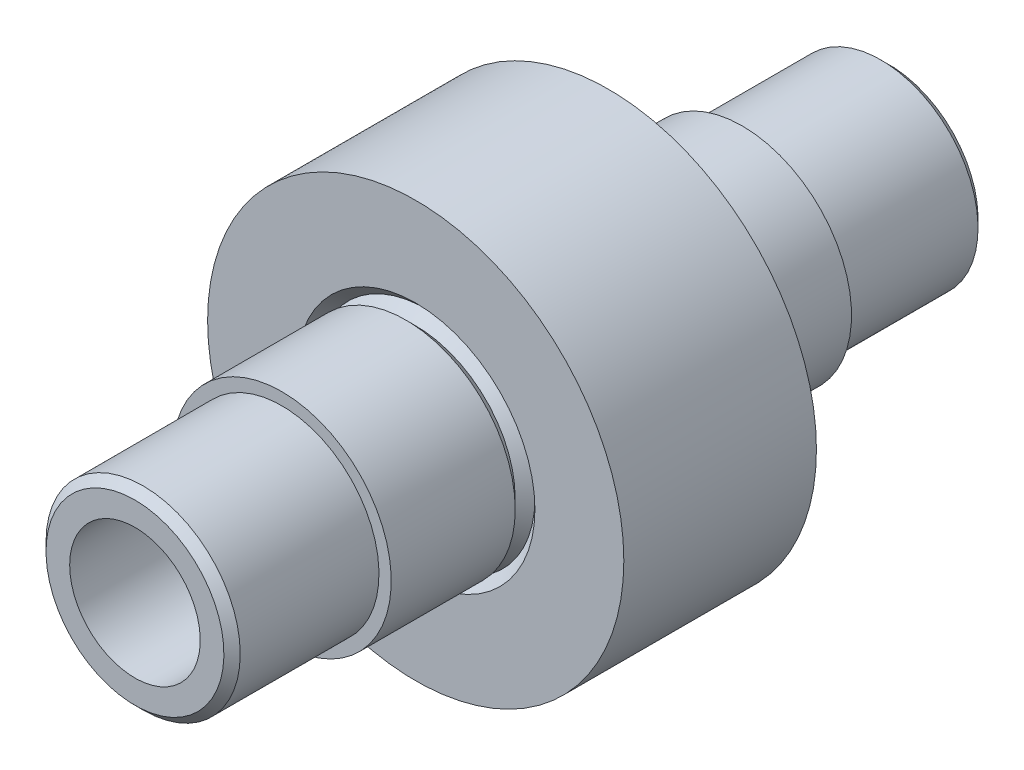
ISO-10303-21;
HEADER;
FILE_DESCRIPTION(('STEP AP214'),'2;1');
FILE_NAME('part.step','',(''),(''),'','','');
FILE_SCHEMA(('AUTOMOTIVE_DESIGN { 1 0 10303 214 1 1 1 1 }'));
ENDSEC;
DATA;
#1=APPLICATION_CONTEXT('core data for automotive mechanical design processes');
#2=APPLICATION_PROTOCOL_DEFINITION('international standard','automotive_design',2000,#1);
#3=PRODUCT_CONTEXT('',#1,'mechanical');
#4=PRODUCT('Part','Part','',(#3));
#5=PRODUCT_RELATED_PRODUCT_CATEGORY('part','',(#4));
#6=PRODUCT_DEFINITION_FORMATION('','',#4);
#7=PRODUCT_DEFINITION_CONTEXT('part definition',#1,'design');
#8=PRODUCT_DEFINITION('design','',#6,#7);
#9=PRODUCT_DEFINITION_SHAPE('','',#8);
#10=(LENGTH_UNIT() NAMED_UNIT(*) SI_UNIT(.MILLI.,.METRE.));
#11=(NAMED_UNIT(*) PLANE_ANGLE_UNIT() SI_UNIT($,.RADIAN.));
#12=(NAMED_UNIT(*) SI_UNIT($,.STERADIAN.) SOLID_ANGLE_UNIT());
#13=UNCERTAINTY_MEASURE_WITH_UNIT(LENGTH_MEASURE(1.E-05),#10,'distance_accuracy_value','');
#14=(GEOMETRIC_REPRESENTATION_CONTEXT(3) GLOBAL_UNCERTAINTY_ASSIGNED_CONTEXT((#13)) GLOBAL_UNIT_ASSIGNED_CONTEXT((#10,
#11,#12)) REPRESENTATION_CONTEXT('',''));
#15=CARTESIAN_POINT('',(0.,0.,0.));
#16=DIRECTION('',(0.,0.,1.));
#17=DIRECTION('',(1.,0.,0.));
#18=AXIS2_PLACEMENT_3D('',#15,#16,#17);
#19=CARTESIAN_POINT('',(0.,0.,23.1));
#20=DIRECTION('',(0.,0.,1.));
#21=DIRECTION('',(0.,-1.,0.));
#22=AXIS2_PLACEMENT_3D('',#19,#20,#21);
#23=CYLINDRICAL_SURFACE('',#22,6.7);
#24=CARTESIAN_POINT('',(0.,0.,-14.1));
#25=DIRECTION('',(0.,0.,1.));
#26=DIRECTION('',(0.,-1.,0.));
#27=AXIS2_PLACEMENT_3D('',#24,#25,#26);
#28=CIRCLE('',#27,6.7);
#29=CARTESIAN_POINT('',(0.,-6.69999999999999,-14.1));
#30=VERTEX_POINT('',#29);
#31=EDGE_CURVE('E66',#30,#30,#28,.T.);
#32=ORIENTED_EDGE('',*,*,#31,.T.);
#33=EDGE_LOOP('',(#32));
#34=FACE_BOUND('',#33,.T.);
#35=CARTESIAN_POINT('',(0.,0.,-6.50214500503883));
#36=DIRECTION('',(0.,0.,1.));
#37=DIRECTION('',(1.,0.,0.));
#38=AXIS2_PLACEMENT_3D('',#35,#36,#37);
#39=CIRCLE('',#38,6.7);
#40=CARTESIAN_POINT('',(6.7,0.,-6.50214500503883));
#41=VERTEX_POINT('',#40);
#42=EDGE_CURVE('E93',#41,#41,#39,.T.);
#43=ORIENTED_EDGE('',*,*,#42,.F.);
#44=EDGE_LOOP('',(#43));
#45=FACE_BOUND('',#44,.T.);
#46=ADVANCED_FACE('F37',(#34,#45),#23,.T.);
#47=CARTESIAN_POINT('',(0.,0.,23.1));
#48=DIRECTION('',(0.,0.,1.));
#49=DIRECTION('',(0.,-1.,0.));
#50=AXIS2_PLACEMENT_3D('',#47,#48,#49);
#51=CYLINDRICAL_SURFACE('',#50,6.7);
#52=CARTESIAN_POINT('',(0.,0.,14.1));
#53=DIRECTION('',(0.,0.,1.));
#54=DIRECTION('',(0.,-1.,0.));
#55=AXIS2_PLACEMENT_3D('',#52,#53,#54);
#56=CIRCLE('',#55,6.7);
#57=CARTESIAN_POINT('',(0.,-6.7,14.1));
#58=VERTEX_POINT('',#57);
#59=EDGE_CURVE('E69',#58,#58,#56,.T.);
#60=ORIENTED_EDGE('',*,*,#59,.F.);
#61=EDGE_LOOP('',(#60));
#62=FACE_BOUND('',#61,.T.);
#63=CARTESIAN_POINT('',(0.,0.,6.50214500503883));
#64=DIRECTION('',(0.,0.,1.));
#65=DIRECTION('',(1.,0.,0.));
#66=AXIS2_PLACEMENT_3D('',#63,#64,#65);
#67=CIRCLE('',#66,6.7);
#68=CARTESIAN_POINT('',(6.7,0.,6.50214500503883));
#69=VERTEX_POINT('',#68);
#70=EDGE_CURVE('E80',#69,#69,#67,.T.);
#71=ORIENTED_EDGE('',*,*,#70,.T.);
#72=EDGE_LOOP('',(#71));
#73=FACE_BOUND('',#72,.T.);
#74=ADVANCED_FACE('F132',(#62,#73),#51,.T.);
#75=CARTESIAN_POINT('',(0.,0.,-23.1));
#76=DIRECTION('',(0.,0.,1.));
#77=DIRECTION('',(0.,-1.,0.));
#78=AXIS2_PLACEMENT_3D('',#75,#76,#77);
#79=PLANE('',#78);
#80=CARTESIAN_POINT('',(0.,0.,-23.1));
#81=DIRECTION('',(0.,0.,1.));
#82=DIRECTION('',(0.,-1.,0.));
#83=AXIS2_PLACEMENT_3D('',#80,#81,#82);
#84=CIRCLE('',#83,5.45);
#85=CARTESIAN_POINT('',(0.,-5.45,-23.1));
#86=VERTEX_POINT('',#85);
#87=EDGE_CURVE('E49',#86,#86,#84,.F.);
#88=ORIENTED_EDGE('',*,*,#87,.T.);
#89=EDGE_LOOP('',(#88));
#90=FACE_BOUND('',#89,.T.);
#91=CARTESIAN_POINT('',(0.,0.,-23.1));
#92=DIRECTION('',(0.,0.,-1.));
#93=DIRECTION('',(-1.,0.,0.));
#94=AXIS2_PLACEMENT_3D('',#91,#92,#93);
#95=CIRCLE('',#94,4.);
#96=CARTESIAN_POINT('',(-4.,0.,-23.1));
#97=VERTEX_POINT('',#96);
#98=EDGE_CURVE('E77',#97,#97,#95,.T.);
#99=ORIENTED_EDGE('',*,*,#98,.F.);
#100=EDGE_LOOP('',(#99));
#101=FACE_BOUND('',#100,.T.);
#102=ADVANCED_FACE('F138',(#90,#101),#79,.F.);
#103=CARTESIAN_POINT('',(0.,0.,23.1));
#104=DIRECTION('',(0.,0.,1.));
#105=DIRECTION('',(0.,-1.,0.));
#106=AXIS2_PLACEMENT_3D('',#103,#104,#105);
#107=CYLINDRICAL_SURFACE('',#106,5.95);
#108=CARTESIAN_POINT('',(0.,0.,-22.6));
#109=DIRECTION('',(0.,0.,1.));
#110=DIRECTION('',(0.,-1.,0.));
#111=AXIS2_PLACEMENT_3D('',#108,#109,#110);
#112=CIRCLE('',#111,5.95);
#113=CARTESIAN_POINT('',(0.,-5.94999999999999,-22.6));
#114=VERTEX_POINT('',#113);
#115=EDGE_CURVE('E53',#114,#114,#112,.T.);
#116=ORIENTED_EDGE('',*,*,#115,.T.);
#117=EDGE_LOOP('',(#116));
#118=FACE_BOUND('',#117,.T.);
#119=CARTESIAN_POINT('',(0.,0.,-14.1));
#120=DIRECTION('',(0.,0.,1.));
#121=DIRECTION('',(0.,-1.,0.));
#122=AXIS2_PLACEMENT_3D('',#119,#120,#121);
#123=CIRCLE('',#122,5.95);
#124=CARTESIAN_POINT('',(0.,-5.94999999999999,-14.1));
#125=VERTEX_POINT('',#124);
#126=EDGE_CURVE('E58',#125,#125,#123,.T.);
#127=ORIENTED_EDGE('',*,*,#126,.F.);
#128=EDGE_LOOP('',(#127));
#129=FACE_BOUND('',#128,.T.);
#130=ADVANCED_FACE('F147',(#118,#129),#107,.T.);
#131=CARTESIAN_POINT('',(0.,6.7,-14.1));
#132=DIRECTION('',(0.,0.,1.));
#133=DIRECTION('',(0.,-1.,0.));
#134=AXIS2_PLACEMENT_3D('',#131,#132,#133);
#135=PLANE('',#134);
#136=ORIENTED_EDGE('',*,*,#31,.F.);
#137=EDGE_LOOP('',(#136));
#138=FACE_BOUND('',#137,.T.);
#139=ORIENTED_EDGE('',*,*,#126,.T.);
#140=EDGE_LOOP('',(#139));
#141=FACE_BOUND('',#140,.T.);
#142=ADVANCED_FACE('F143',(#138,#141),#135,.F.);
#143=CARTESIAN_POINT('',(0.,6.7,14.1));
#144=DIRECTION('',(0.,0.,-1.));
#145=DIRECTION('',(0.,1.,0.));
#146=AXIS2_PLACEMENT_3D('',#143,#144,#145);
#147=PLANE('',#146);
#148=CARTESIAN_POINT('',(0.,0.,14.1));
#149=DIRECTION('',(0.,0.,1.));
#150=DIRECTION('',(0.,-1.,0.));
#151=AXIS2_PLACEMENT_3D('',#148,#149,#150);
#152=CIRCLE('',#151,5.95);
#153=CARTESIAN_POINT('',(0.,-5.95,14.1));
#154=VERTEX_POINT('',#153);
#155=EDGE_CURVE('E62',#154,#154,#152,.T.);
#156=ORIENTED_EDGE('',*,*,#155,.F.);
#157=EDGE_LOOP('',(#156));
#158=FACE_BOUND('',#157,.T.);
#159=ORIENTED_EDGE('',*,*,#59,.T.);
#160=EDGE_LOOP('',(#159));
#161=FACE_BOUND('',#160,.T.);
#162=ADVANCED_FACE('F146',(#158,#161),#147,.F.);
#163=CARTESIAN_POINT('',(0.,0.,23.1));
#164=DIRECTION('',(0.,0.,1.));
#165=DIRECTION('',(0.,-1.,0.));
#166=AXIS2_PLACEMENT_3D('',#163,#164,#165);
#167=CYLINDRICAL_SURFACE('',#166,5.95);
#168=CARTESIAN_POINT('',(0.,0.,22.6));
#169=DIRECTION('',(0.,0.,-1.));
#170=DIRECTION('',(0.,1.,0.));
#171=AXIS2_PLACEMENT_3D('',#168,#169,#170);
#172=CIRCLE('',#171,5.95);
#173=CARTESIAN_POINT('',(0.,5.95,22.6));
#174=VERTEX_POINT('',#173);
#175=EDGE_CURVE('E10',#174,#174,#172,.T.);
#176=ORIENTED_EDGE('',*,*,#175,.T.);
#177=EDGE_LOOP('',(#176));
#178=FACE_BOUND('',#177,.T.);
#179=ORIENTED_EDGE('',*,*,#155,.T.);
#180=EDGE_LOOP('',(#179));
#181=FACE_BOUND('',#180,.T.);
#182=ADVANCED_FACE('F184',(#178,#181),#167,.T.);
#183=CARTESIAN_POINT('',(0.,0.,23.1));
#184=DIRECTION('',(0.,0.,-1.));
#185=DIRECTION('',(0.,1.,0.));
#186=AXIS2_PLACEMENT_3D('',#183,#184,#185);
#187=PLANE('',#186);
#188=CARTESIAN_POINT('',(0.,0.,23.1));
#189=DIRECTION('',(0.,0.,-1.));
#190=DIRECTION('',(0.,1.,0.));
#191=AXIS2_PLACEMENT_3D('',#188,#189,#190);
#192=CIRCLE('',#191,5.45000000000002);
#193=CARTESIAN_POINT('',(0.,5.45000000000002,23.1));
#194=VERTEX_POINT('',#193);
#195=EDGE_CURVE('E45',#194,#194,#192,.F.);
#196=ORIENTED_EDGE('',*,*,#195,.T.);
#197=EDGE_LOOP('',(#196));
#198=FACE_BOUND('',#197,.T.);
#199=CARTESIAN_POINT('',(0.,0.,23.1));
#200=DIRECTION('',(0.,0.,-1.));
#201=DIRECTION('',(-1.,0.,0.));
#202=AXIS2_PLACEMENT_3D('',#199,#200,#201);
#203=CIRCLE('',#202,4.);
#204=CARTESIAN_POINT('',(-4.,0.,23.1));
#205=VERTEX_POINT('',#204);
#206=EDGE_CURVE('E76',#205,#205,#203,.T.);
#207=ORIENTED_EDGE('',*,*,#206,.T.);
#208=EDGE_LOOP('',(#207));
#209=FACE_BOUND('',#208,.T.);
#210=ADVANCED_FACE('F175',(#198,#209),#187,.F.);
#211=CARTESIAN_POINT('',(0.,0.,23.1));
#212=DIRECTION('',(0.,0.,-1.));
#213=DIRECTION('',(-1.,0.,0.));
#214=AXIS2_PLACEMENT_3D('',#211,#212,#213);
#215=CYLINDRICAL_SURFACE('',#214,4.);
#216=ORIENTED_EDGE('',*,*,#206,.F.);
#217=EDGE_LOOP('',(#216));
#218=FACE_BOUND('',#217,.T.);
#219=ORIENTED_EDGE('',*,*,#98,.T.);
#220=EDGE_LOOP('',(#219));
#221=FACE_BOUND('',#220,.T.);
#222=ADVANCED_FACE('F172',(#218,#221),#215,.F.);
#223=CARTESIAN_POINT('',(0.,0.,6.50214500503883));
#224=DIRECTION('',(0.,0.,1.));
#225=DIRECTION('',(1.,0.,0.));
#226=AXIS2_PLACEMENT_3D('',#223,#224,#225);
#227=CONICAL_SURFACE('',#226,6.7,0.789222868382651);
#228=CARTESIAN_POINT('',(0.,0.,5.9));
#229=DIRECTION('',(0.,0.,1.));
#230=DIRECTION('',(1.,0.,0.));
#231=AXIS2_PLACEMENT_3D('',#228,#229,#230);
#232=CIRCLE('',#231,6.09323123388792);
#233=CARTESIAN_POINT('',(6.09323123388792,0.,5.9));
#234=VERTEX_POINT('',#233);
#235=EDGE_CURVE('E98',#234,#234,#232,.T.);
#236=ORIENTED_EDGE('',*,*,#235,.T.);
#237=EDGE_LOOP('',(#236));
#238=FACE_BOUND('',#237,.T.);
#239=ORIENTED_EDGE('',*,*,#70,.F.);
#240=EDGE_LOOP('',(#239));
#241=FACE_BOUND('',#240,.T.);
#242=ADVANCED_FACE('F174',(#238,#241),#227,.T.);
#243=CARTESIAN_POINT('',(0.,0.,5.9));
#244=DIRECTION('',(0.,0.,-1.));
#245=DIRECTION('',(-1.,0.,0.));
#246=AXIS2_PLACEMENT_3D('',#243,#244,#245);
#247=CONICAL_SURFACE('',#246,6.09323123388792,0.786668738075362);
#248=CARTESIAN_POINT('',(0.,0.,5.29477116817422));
#249=DIRECTION('',(0.,0.,1.));
#250=DIRECTION('',(1.,0.,0.));
#251=AXIS2_PLACEMENT_3D('',#248,#249,#250);
#252=CIRCLE('',#251,6.7);
#253=CARTESIAN_POINT('',(6.7,0.,5.29477116817422));
#254=VERTEX_POINT('',#253);
#255=EDGE_CURVE('E101',#254,#254,#252,.T.);
#256=ORIENTED_EDGE('',*,*,#255,.T.);
#257=EDGE_LOOP('',(#256));
#258=FACE_BOUND('',#257,.T.);
#259=ORIENTED_EDGE('',*,*,#235,.F.);
#260=EDGE_LOOP('',(#259));
#261=FACE_BOUND('',#260,.T.);
#262=ADVANCED_FACE('F181',(#258,#261),#247,.T.);
#263=CARTESIAN_POINT('',(0.,0.,5.29477116817422));
#264=DIRECTION('',(0.,0.,1.));
#265=DIRECTION('',(1.,0.,0.));
#266=AXIS2_PLACEMENT_3D('',#263,#264,#265);
#267=CONICAL_SURFACE('',#266,6.7,0.784127588719536);
#268=CARTESIAN_POINT('',(0.,0.,5.9));
#269=DIRECTION('',(0.,0.,1.));
#270=DIRECTION('',(1.,0.,0.));
#271=AXIS2_PLACEMENT_3D('',#268,#269,#270);
#272=CIRCLE('',#271,7.3036928057789);
#273=CARTESIAN_POINT('',(7.3036928057789,0.,5.9));
#274=VERTEX_POINT('',#273);
#275=EDGE_CURVE('E86',#274,#274,#272,.T.);
#276=ORIENTED_EDGE('',*,*,#275,.T.);
#277=EDGE_LOOP('',(#276));
#278=FACE_BOUND('',#277,.T.);
#279=ORIENTED_EDGE('',*,*,#255,.F.);
#280=EDGE_LOOP('',(#279));
#281=FACE_BOUND('',#280,.T.);
#282=ADVANCED_FACE('F107',(#278,#281),#267,.F.);
#283=CARTESIAN_POINT('',(0.,0.,-5.9));
#284=DIRECTION('',(0.,0.,-1.));
#285=DIRECTION('',(-1.,0.,0.));
#286=AXIS2_PLACEMENT_3D('',#283,#284,#285);
#287=CONICAL_SURFACE('',#286,6.09323123388791,0.789222868382651);
#288=ORIENTED_EDGE('',*,*,#42,.T.);
#289=EDGE_LOOP('',(#288));
#290=FACE_BOUND('',#289,.T.);
#291=CARTESIAN_POINT('',(0.,0.,-5.9));
#292=DIRECTION('',(0.,0.,1.));
#293=DIRECTION('',(1.,0.,0.));
#294=AXIS2_PLACEMENT_3D('',#291,#292,#293);
#295=CIRCLE('',#294,6.09323123388791);
#296=CARTESIAN_POINT('',(6.09323123388791,0.,-5.9));
#297=VERTEX_POINT('',#296);
#298=EDGE_CURVE('E83',#297,#297,#295,.T.);
#299=ORIENTED_EDGE('',*,*,#298,.F.);
#300=EDGE_LOOP('',(#299));
#301=FACE_BOUND('',#300,.T.);
#302=ADVANCED_FACE('F187',(#290,#301),#287,.T.);
#303=CARTESIAN_POINT('',(0.,0.,-5.29477116817422));
#304=DIRECTION('',(0.,0.,1.));
#305=DIRECTION('',(1.,0.,0.));
#306=AXIS2_PLACEMENT_3D('',#303,#304,#305);
#307=CONICAL_SURFACE('',#306,6.7,0.786668738075362);
#308=ORIENTED_EDGE('',*,*,#298,.T.);
#309=EDGE_LOOP('',(#308));
#310=FACE_BOUND('',#309,.T.);
#311=CARTESIAN_POINT('',(0.,0.,-5.29477116817422));
#312=DIRECTION('',(0.,0.,1.));
#313=DIRECTION('',(1.,0.,0.));
#314=AXIS2_PLACEMENT_3D('',#311,#312,#313);
#315=CIRCLE('',#314,6.7);
#316=CARTESIAN_POINT('',(6.7,0.,-5.29477116817422));
#317=VERTEX_POINT('',#316);
#318=EDGE_CURVE('E87',#317,#317,#315,.T.);
#319=ORIENTED_EDGE('',*,*,#318,.F.);
#320=EDGE_LOOP('',(#319));
#321=FACE_BOUND('',#320,.T.);
#322=ADVANCED_FACE('F190',(#310,#321),#307,.T.);
#323=CARTESIAN_POINT('',(0.,0.,-5.9));
#324=DIRECTION('',(0.,0.,-1.));
#325=DIRECTION('',(-1.,0.,0.));
#326=AXIS2_PLACEMENT_3D('',#323,#324,#325);
#327=CONICAL_SURFACE('',#326,7.30369280577889,0.784127588719536);
#328=ORIENTED_EDGE('',*,*,#318,.T.);
#329=EDGE_LOOP('',(#328));
#330=FACE_BOUND('',#329,.T.);
#331=CARTESIAN_POINT('',(0.,0.,-5.9));
#332=DIRECTION('',(0.,0.,1.));
#333=DIRECTION('',(1.,0.,0.));
#334=AXIS2_PLACEMENT_3D('',#331,#332,#333);
#335=CIRCLE('',#334,7.30369280577889);
#336=CARTESIAN_POINT('',(7.30369280577889,0.,-5.9));
#337=VERTEX_POINT('',#336);
#338=EDGE_CURVE('E90',#337,#337,#335,.T.);
#339=ORIENTED_EDGE('',*,*,#338,.F.);
#340=EDGE_LOOP('',(#339));
#341=FACE_BOUND('',#340,.T.);
#342=ADVANCED_FACE('F125',(#330,#341),#327,.F.);
#343=CARTESIAN_POINT('',(0.,6.7,-5.9));
#344=DIRECTION('',(0.,0.,1.));
#345=DIRECTION('',(0.,-1.,0.));
#346=AXIS2_PLACEMENT_3D('',#343,#344,#345);
#347=PLANE('',#346);
#348=ORIENTED_EDGE('',*,*,#338,.T.);
#349=EDGE_LOOP('',(#348));
#350=FACE_BOUND('',#349,.T.);
#351=CARTESIAN_POINT('',(0.,0.,-5.9));
#352=DIRECTION('',(0.,0.,-1.));
#353=DIRECTION('',(-1.,0.,0.));
#354=AXIS2_PLACEMENT_3D('',#351,#352,#353);
#355=CIRCLE('',#354,12.75);
#356=CARTESIAN_POINT('',(-12.75,0.,-5.9));
#357=VERTEX_POINT('',#356);
#358=EDGE_CURVE('E63',#357,#357,#355,.T.);
#359=ORIENTED_EDGE('',*,*,#358,.T.);
#360=EDGE_LOOP('',(#359));
#361=FACE_BOUND('',#360,.T.);
#362=ADVANCED_FACE('F119',(#350,#361),#347,.F.);
#363=CARTESIAN_POINT('',(0.,0.,23.1));
#364=DIRECTION('',(0.,0.,-1.));
#365=DIRECTION('',(-1.,0.,0.));
#366=AXIS2_PLACEMENT_3D('',#363,#364,#365);
#367=CYLINDRICAL_SURFACE('',#366,12.75);
#368=CARTESIAN_POINT('',(0.,0.,5.9));
#369=DIRECTION('',(0.,0.,-1.));
#370=DIRECTION('',(0.,1.,0.));
#371=AXIS2_PLACEMENT_3D('',#368,#369,#370);
#372=CIRCLE('',#371,12.75);
#373=CARTESIAN_POINT('',(-12.75,0.,5.9));
#374=VERTEX_POINT('',#373);
#375=EDGE_CURVE('E59',#374,#374,#372,.T.);
#376=CARTESIAN_POINT('',(-12.75,0.,-5.9));
#377=CARTESIAN_POINT('',(-12.75,0.,-5.77708333333334));
#378=CARTESIAN_POINT('',(-12.75,0.,-5.65416666666667));
#379=CARTESIAN_POINT('',(-12.75,0.,-5.40833333333333));
#380=CARTESIAN_POINT('',(-12.75,0.,-5.28541666666667));
#381=CARTESIAN_POINT('',(-12.75,0.,-5.03958333333333));
#382=CARTESIAN_POINT('',(-12.75,0.,-4.91666666666667));
#383=CARTESIAN_POINT('',(-12.75,0.,-4.67083333333334));
#384=CARTESIAN_POINT('',(-12.75,0.,-4.54791666666667));
#385=CARTESIAN_POINT('',(-12.75,0.,-4.30208333333333));
#386=CARTESIAN_POINT('',(-12.75,0.,-4.17916666666667));
#387=CARTESIAN_POINT('',(-12.75,0.,-3.93333333333333));
#388=CARTESIAN_POINT('',(-12.75,0.,-3.81041666666667));
#389=CARTESIAN_POINT('',(-12.75,0.,-3.56458333333334));
#390=CARTESIAN_POINT('',(-12.75,0.,-3.44166666666667));
#391=CARTESIAN_POINT('',(-12.75,0.,-3.19583333333334));
#392=CARTESIAN_POINT('',(-12.75,0.,-3.07291666666667));
#393=CARTESIAN_POINT('',(-12.75,0.,-2.82708333333333));
#394=CARTESIAN_POINT('',(-12.75,0.,-2.70416666666667));
#395=CARTESIAN_POINT('',(-12.75,0.,-2.45833333333333));
#396=CARTESIAN_POINT('',(-12.75,0.,-2.33541666666667));
#397=CARTESIAN_POINT('',(-12.75,0.,-2.08958333333333));
#398=CARTESIAN_POINT('',(-12.75,0.,-1.96666666666667));
#399=CARTESIAN_POINT('',(-12.75,0.,-1.72083333333333));
#400=CARTESIAN_POINT('',(-12.75,0.,-1.59791666666667));
#401=CARTESIAN_POINT('',(-12.75,0.,-1.35208333333333));
#402=CARTESIAN_POINT('',(-12.75,0.,-1.22916666666667));
#403=CARTESIAN_POINT('',(-12.75,0.,-0.983333333333334));
#404=CARTESIAN_POINT('',(-12.75,0.,-0.860416666666668));
#405=CARTESIAN_POINT('',(-12.75,0.,-0.614583333333335));
#406=CARTESIAN_POINT('',(-12.75,0.,-0.491666666666668));
#407=CARTESIAN_POINT('',(-12.75,0.,-0.245833333333334));
#408=CARTESIAN_POINT('',(-12.75,0.,-0.122916666666667));
#409=CARTESIAN_POINT('',(-12.75,0.,0.122916666666667));
#410=CARTESIAN_POINT('',(-12.75,0.,0.245833333333334));
#411=CARTESIAN_POINT('',(-12.75,0.,0.491666666666668));
#412=CARTESIAN_POINT('',(-12.75,0.,0.614583333333335));
#413=CARTESIAN_POINT('',(-12.75,0.,0.860416666666668));
#414=CARTESIAN_POINT('',(-12.75,0.,0.983333333333334));
#415=CARTESIAN_POINT('',(-12.75,0.,1.22916666666667));
#416=CARTESIAN_POINT('',(-12.75,0.,1.35208333333333));
#417=CARTESIAN_POINT('',(-12.75,0.,1.59791666666667));
#418=CARTESIAN_POINT('',(-12.75,0.,1.72083333333333));
#419=CARTESIAN_POINT('',(-12.75,0.,1.96666666666667));
#420=CARTESIAN_POINT('',(-12.75,0.,2.08958333333333));
#421=CARTESIAN_POINT('',(-12.75,0.,2.33541666666667));
#422=CARTESIAN_POINT('',(-12.75,0.,2.45833333333333));
#423=CARTESIAN_POINT('',(-12.75,0.,2.70416666666667));
#424=CARTESIAN_POINT('',(-12.75,0.,2.82708333333333));
#425=CARTESIAN_POINT('',(-12.75,0.,3.07291666666667));
#426=CARTESIAN_POINT('',(-12.75,0.,3.19583333333334));
#427=CARTESIAN_POINT('',(-12.75,0.,3.44166666666667));
#428=CARTESIAN_POINT('',(-12.75,0.,3.56458333333334));
#429=CARTESIAN_POINT('',(-12.75,0.,3.81041666666667));
#430=CARTESIAN_POINT('',(-12.75,0.,3.93333333333333));
#431=CARTESIAN_POINT('',(-12.75,0.,4.17916666666667));
#432=CARTESIAN_POINT('',(-12.75,0.,4.30208333333333));
#433=CARTESIAN_POINT('',(-12.75,0.,4.54791666666667));
#434=CARTESIAN_POINT('',(-12.75,0.,4.67083333333334));
#435=CARTESIAN_POINT('',(-12.75,0.,4.91666666666667));
#436=CARTESIAN_POINT('',(-12.75,0.,5.03958333333333));
#437=CARTESIAN_POINT('',(-12.75,0.,5.28541666666667));
#438=CARTESIAN_POINT('',(-12.75,0.,5.40833333333333));
#439=CARTESIAN_POINT('',(-12.75,0.,5.65416666666667));
#440=CARTESIAN_POINT('',(-12.75,0.,5.77708333333334));
#441=CARTESIAN_POINT('',(-12.75,0.,5.9));
#442=B_SPLINE_CURVE_WITH_KNOTS('',3,(#376,#377,#378,#379,#380,#381,#382,#383,#384,#385,#386,
#387,#388,#389,#390,#391,#392,#393,#394,#395,#396,#397,#398,#399,#400,#401,#402,#403,#404,#405,
#406,#407,#408,#409,#410,#411,#412,#413,#414,#415,#416,#417,#418,#419,#420,#421,#422,#423,#424,
#425,#426,#427,#428,#429,#430,#431,#432,#433,#434,#435,#436,#437,#438,#439,#440,#441),
.UNSPECIFIED.,.F.,.F.,(4,2,2,2,2,2,2,2,2,2,2,2,2,2,2,2,2,2,2,2,2,2,2,2,2,2,2,2,2,2,2,2,4),(0.,
0.368750000000001,0.737500000000002,1.10625,1.475,1.84375,2.2125,2.58125,2.95,3.31875,3.6875,
4.05625,4.425,4.79375,5.1625,5.53125,5.9,6.26875,6.6375,7.00625,7.375,7.74375,8.1125,8.48125,
8.85,9.21875000000001,9.58750000000001,9.95625,10.325,10.69375,11.0625,11.43125,11.8),.UNSPECIFIED.);
#443=EDGE_CURVE('BSEAM114',#357,#374,#442,.T.);
#444=ORIENTED_EDGE('',*,*,#358,.F.);
#445=ORIENTED_EDGE('',*,*,#375,.T.);
#446=ORIENTED_EDGE('',*,*,#443,.T.);
#447=ORIENTED_EDGE('',*,*,#443,.F.);
#448=EDGE_LOOP('',(#444,#446,#445,#447));
#449=FACE_BOUND('',#448,.T.);
#450=ADVANCED_FACE('F114',(#449),#367,.T.);
#451=CARTESIAN_POINT('',(0.,6.7,5.9));
#452=DIRECTION('',(0.,0.,-1.));
#453=DIRECTION('',(0.,1.,0.));
#454=AXIS2_PLACEMENT_3D('',#451,#452,#453);
#455=PLANE('',#454);
#456=ORIENTED_EDGE('',*,*,#275,.F.);
#457=EDGE_LOOP('',(#456));
#458=FACE_BOUND('',#457,.T.);
#459=ORIENTED_EDGE('',*,*,#375,.F.);
#460=EDGE_LOOP('',(#459));
#461=FACE_BOUND('',#460,.T.);
#462=ADVANCED_FACE('F110',(#458,#461),#455,.F.);
#463=CARTESIAN_POINT('',(0.,0.,-22.6));
#464=DIRECTION('',(0.,0.,1.));
#465=DIRECTION('',(0.,-1.,0.));
#466=AXIS2_PLACEMENT_3D('',#463,#464,#465);
#467=CONICAL_SURFACE('',#466,5.95,0.785398163397453);
#468=ORIENTED_EDGE('',*,*,#87,.F.);
#469=EDGE_LOOP('',(#468));
#470=FACE_BOUND('',#469,.T.);
#471=ORIENTED_EDGE('',*,*,#115,.F.);
#472=EDGE_LOOP('',(#471));
#473=FACE_BOUND('',#472,.T.);
#474=ADVANCED_FACE('F113',(#470,#473),#467,.T.);
#475=CARTESIAN_POINT('',(0.,0.,23.1));
#476=DIRECTION('',(0.,0.,-1.));
#477=DIRECTION('',(0.,1.,0.));
#478=AXIS2_PLACEMENT_3D('',#475,#476,#477);
#479=CONICAL_SURFACE('',#478,5.45000000000002,0.78539816339745);
#480=ORIENTED_EDGE('',*,*,#175,.F.);
#481=EDGE_LOOP('',(#480));
#482=FACE_BOUND('',#481,.T.);
#483=ORIENTED_EDGE('',*,*,#195,.F.);
#484=EDGE_LOOP('',(#483));
#485=FACE_BOUND('',#484,.T.);
#486=ADVANCED_FACE('F40',(#482,#485),#479,.T.);
#487=CLOSED_SHELL('',(#46,#74,#102,#130,#142,#162,#182,#210,#222,#242,#262,#282,#302,#322,#342,
#362,#450,#462,#474,#486));
#488=MANIFOLD_SOLID_BREP('B2',#487);
#489=ADVANCED_BREP_SHAPE_REPRESENTATION('',(#18,#488),#14);
#490=SHAPE_DEFINITION_REPRESENTATION(#9,#489);
ENDSEC;
END-ISO-10303-21;
